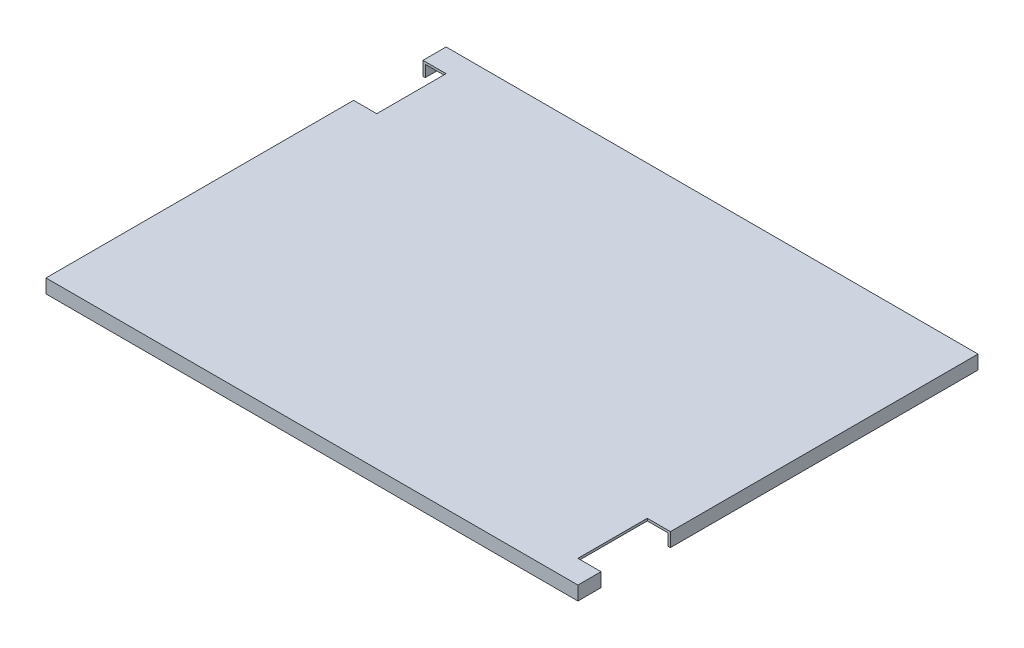
ISO-10303-21;
HEADER;
FILE_DESCRIPTION(('STEP AP214'),'2;1');
FILE_NAME('part.step','',(''),(''),'','','');
FILE_SCHEMA(('AUTOMOTIVE_DESIGN { 1 0 10303 214 1 1 1 1 }'));
ENDSEC;
DATA;
#1=APPLICATION_CONTEXT('core data for automotive mechanical design processes');
#2=APPLICATION_PROTOCOL_DEFINITION('international standard','automotive_design',2000,#1);
#3=PRODUCT_CONTEXT('',#1,'mechanical');
#4=PRODUCT('Part','Part','',(#3));
#5=PRODUCT_RELATED_PRODUCT_CATEGORY('part','',(#4));
#6=PRODUCT_DEFINITION_FORMATION('','',#4);
#7=PRODUCT_DEFINITION_CONTEXT('part definition',#1,'design');
#8=PRODUCT_DEFINITION('design','',#6,#7);
#9=PRODUCT_DEFINITION_SHAPE('','',#8);
#10=(LENGTH_UNIT() NAMED_UNIT(*) SI_UNIT(.MILLI.,.METRE.));
#11=(NAMED_UNIT(*) PLANE_ANGLE_UNIT() SI_UNIT($,.RADIAN.));
#12=(NAMED_UNIT(*) SI_UNIT($,.STERADIAN.) SOLID_ANGLE_UNIT());
#13=UNCERTAINTY_MEASURE_WITH_UNIT(LENGTH_MEASURE(1.E-05),#10,'distance_accuracy_value','');
#14=(GEOMETRIC_REPRESENTATION_CONTEXT(3) GLOBAL_UNCERTAINTY_ASSIGNED_CONTEXT((#13)) GLOBAL_UNIT_ASSIGNED_CONTEXT((#10,
#11,#12)) REPRESENTATION_CONTEXT('',''));
#15=CARTESIAN_POINT('',(0.,0.,0.));
#16=DIRECTION('',(0.,0.,1.));
#17=DIRECTION('',(1.,0.,0.));
#18=AXIS2_PLACEMENT_3D('',#15,#16,#17);
#19=CARTESIAN_POINT('',(115.,6.,86.5));
#20=DIRECTION('',(-1.,0.,0.));
#21=DIRECTION('',(0.,0.,1.));
#22=AXIS2_PLACEMENT_3D('',#19,#20,#21);
#23=PLANE('',#22);
#24=DIRECTION('',(0.,1.,0.));
#25=VECTOR('',#24,1.);
#26=CARTESIAN_POINT('',(115.,0.,46.5));
#27=LINE('',#26,#25);
#28=CARTESIAN_POINT('',(115.,0.,46.5));
#29=VERTEX_POINT('',#28);
#30=CARTESIAN_POINT('',(115.,6.,46.5));
#31=VERTEX_POINT('',#30);
#32=EDGE_CURVE('E184',#29,#31,#27,.T.);
#33=ORIENTED_EDGE('',*,*,#32,.F.);
#34=DIRECTION('',(0.,0.,-1.));
#35=VECTOR('',#34,1.);
#36=CARTESIAN_POINT('',(115.,0.,86.5));
#37=LINE('',#36,#35);
#38=CARTESIAN_POINT('',(115.,0.,-86.5));
#39=VERTEX_POINT('',#38);
#40=EDGE_CURVE('E196',#29,#39,#37,.T.);
#41=ORIENTED_EDGE('',*,*,#40,.T.);
#42=DIRECTION('',(0.,-1.,0.));
#43=VECTOR('',#42,1.);
#44=CARTESIAN_POINT('',(115.,6.,-86.5));
#45=LINE('',#44,#43);
#46=CARTESIAN_POINT('',(115.,6.,-86.5));
#47=VERTEX_POINT('',#46);
#48=EDGE_CURVE('E242',#47,#39,#45,.T.);
#49=ORIENTED_EDGE('',*,*,#48,.F.);
#50=DIRECTION('',(0.,0.,-1.));
#51=VECTOR('',#50,1.);
#52=CARTESIAN_POINT('',(115.,6.,86.5));
#53=LINE('',#52,#51);
#54=EDGE_CURVE('E199',#31,#47,#53,.T.);
#55=ORIENTED_EDGE('',*,*,#54,.F.);
#56=EDGE_LOOP('',(#33,#41,#49,#55));
#57=FACE_BOUND('',#56,.T.);
#58=ADVANCED_FACE('F44',(#57),#23,.F.);
#59=CARTESIAN_POINT('',(-115.,6.,86.5));
#60=DIRECTION('',(1.,0.,0.));
#61=DIRECTION('',(0.,0.,-1.));
#62=AXIS2_PLACEMENT_3D('',#59,#60,#61);
#63=PLANE('',#62);
#64=DIRECTION('',(0.,1.,0.));
#65=VECTOR('',#64,1.);
#66=CARTESIAN_POINT('',(-115.,0.,-46.5));
#67=LINE('',#66,#65);
#68=CARTESIAN_POINT('',(-115.,0.,-46.5));
#69=VERTEX_POINT('',#68);
#70=CARTESIAN_POINT('',(-115.,6.,-46.5));
#71=VERTEX_POINT('',#70);
#72=EDGE_CURVE('E287',#69,#71,#67,.T.);
#73=ORIENTED_EDGE('',*,*,#72,.F.);
#74=DIRECTION('',(0.,0.,1.));
#75=VECTOR('',#74,1.);
#76=CARTESIAN_POINT('',(-115.,0.,86.5));
#77=LINE('',#76,#75);
#78=CARTESIAN_POINT('',(-115.,0.,86.5));
#79=VERTEX_POINT('',#78);
#80=EDGE_CURVE('E224',#69,#79,#77,.T.);
#81=ORIENTED_EDGE('',*,*,#80,.T.);
#82=DIRECTION('',(0.,-1.,0.));
#83=VECTOR('',#82,1.);
#84=CARTESIAN_POINT('',(-115.,6.,86.5));
#85=LINE('',#84,#83);
#86=CARTESIAN_POINT('',(-115.,6.,86.5));
#87=VERTEX_POINT('',#86);
#88=EDGE_CURVE('E231',#87,#79,#85,.T.);
#89=ORIENTED_EDGE('',*,*,#88,.F.);
#90=DIRECTION('',(0.,0.,1.));
#91=VECTOR('',#90,1.);
#92=CARTESIAN_POINT('',(-115.,6.,86.5));
#93=LINE('',#92,#91);
#94=EDGE_CURVE('E378',#71,#87,#93,.T.);
#95=ORIENTED_EDGE('',*,*,#94,.F.);
#96=EDGE_LOOP('',(#73,#81,#89,#95));
#97=FACE_BOUND('',#96,.T.);
#98=ADVANCED_FACE('F398',(#97),#63,.F.);
#99=CARTESIAN_POINT('',(0.,0.,0.));
#100=DIRECTION('',(0.,-1.,0.));
#101=DIRECTION('',(0.,0.,-1.));
#102=AXIS2_PLACEMENT_3D('',#99,#100,#101);
#103=PLANE('',#102);
#104=DIRECTION('',(0.,0.,-1.));
#105=VECTOR('',#104,1.);
#106=CARTESIAN_POINT('',(114.,0.,85.5));
#107=LINE('',#106,#105);
#108=CARTESIAN_POINT('',(114.,0.,85.5));
#109=VERTEX_POINT('',#108);
#110=CARTESIAN_POINT('',(114.,0.,76.5));
#111=VERTEX_POINT('',#110);
#112=EDGE_CURVE('E354',#109,#111,#107,.T.);
#113=ORIENTED_EDGE('',*,*,#112,.T.);
#114=DIRECTION('',(1.,0.,0.));
#115=VECTOR('',#114,1.);
#116=CARTESIAN_POINT('',(115.,0.,76.5));
#117=LINE('',#116,#115);
#118=CARTESIAN_POINT('',(115.,0.,76.5));
#119=VERTEX_POINT('',#118);
#120=EDGE_CURVE('E194',#111,#119,#117,.T.);
#121=ORIENTED_EDGE('',*,*,#120,.T.);
#122=CARTESIAN_POINT('',(115.,0.,86.5));
#123=VERTEX_POINT('',#122);
#124=EDGE_CURVE('E208',#123,#119,#37,.T.);
#125=ORIENTED_EDGE('',*,*,#124,.F.);
#126=DIRECTION('',(1.,0.,0.));
#127=VECTOR('',#126,1.);
#128=CARTESIAN_POINT('',(-115.,0.,86.5));
#129=LINE('',#128,#127);
#130=EDGE_CURVE('E227',#79,#123,#129,.T.);
#131=ORIENTED_EDGE('',*,*,#130,.F.);
#132=ORIENTED_EDGE('',*,*,#80,.F.);
#133=DIRECTION('',(1.,0.,0.));
#134=VECTOR('',#133,1.);
#135=CARTESIAN_POINT('',(-115.,0.,-46.5));
#136=LINE('',#135,#134);
#137=CARTESIAN_POINT('',(-114.,0.,-46.5));
#138=VERTEX_POINT('',#137);
#139=EDGE_CURVE('E301',#69,#138,#136,.T.);
#140=ORIENTED_EDGE('',*,*,#139,.T.);
#141=DIRECTION('',(0.,0.,1.));
#142=VECTOR('',#141,1.);
#143=CARTESIAN_POINT('',(-114.,0.,85.5));
#144=LINE('',#143,#142);
#145=CARTESIAN_POINT('',(-114.,0.,85.5));
#146=VERTEX_POINT('',#145);
#147=EDGE_CURVE('E328',#138,#146,#144,.T.);
#148=ORIENTED_EDGE('',*,*,#147,.T.);
#149=DIRECTION('',(1.,0.,0.));
#150=VECTOR('',#149,1.);
#151=CARTESIAN_POINT('',(114.,0.,85.5));
#152=LINE('',#151,#150);
#153=EDGE_CURVE('E348',#146,#109,#152,.T.);
#154=ORIENTED_EDGE('',*,*,#153,.T.);
#155=EDGE_LOOP('',(#113,#121,#125,#131,#132,#140,#148,#154));
#156=FACE_BOUND('',#155,.T.);
#157=ADVANCED_FACE('F412',(#156),#103,.T.);
#158=ORIENTED_EDGE('',*,*,#40,.F.);
#159=DIRECTION('',(-1.,0.,0.));
#160=VECTOR('',#159,1.);
#161=CARTESIAN_POINT('',(115.,0.,46.5));
#162=LINE('',#161,#160);
#163=CARTESIAN_POINT('',(114.,0.,46.5));
#164=VERTEX_POINT('',#163);
#165=EDGE_CURVE('E182',#29,#164,#162,.T.);
#166=ORIENTED_EDGE('',*,*,#165,.T.);
#167=CARTESIAN_POINT('',(114.,0.,-85.5));
#168=VERTEX_POINT('',#167);
#169=EDGE_CURVE('E353',#164,#168,#107,.T.);
#170=ORIENTED_EDGE('',*,*,#169,.T.);
#171=DIRECTION('',(-1.,0.,0.));
#172=VECTOR('',#171,1.);
#173=CARTESIAN_POINT('',(114.,0.,-85.5));
#174=LINE('',#173,#172);
#175=CARTESIAN_POINT('',(-114.,0.,-85.5));
#176=VERTEX_POINT('',#175);
#177=EDGE_CURVE('E360',#168,#176,#174,.T.);
#178=ORIENTED_EDGE('',*,*,#177,.T.);
#179=CARTESIAN_POINT('',(-114.,0.,-76.5));
#180=VERTEX_POINT('',#179);
#181=EDGE_CURVE('E347',#176,#180,#144,.T.);
#182=ORIENTED_EDGE('',*,*,#181,.T.);
#183=DIRECTION('',(-1.,0.,0.));
#184=VECTOR('',#183,1.);
#185=CARTESIAN_POINT('',(-115.,0.,-76.5));
#186=LINE('',#185,#184);
#187=CARTESIAN_POINT('',(-115.,0.,-76.5));
#188=VERTEX_POINT('',#187);
#189=EDGE_CURVE('E292',#180,#188,#186,.T.);
#190=ORIENTED_EDGE('',*,*,#189,.T.);
#191=CARTESIAN_POINT('',(-115.,0.,-86.5));
#192=VERTEX_POINT('',#191);
#193=EDGE_CURVE('E221',#192,#188,#77,.T.);
#194=ORIENTED_EDGE('',*,*,#193,.F.);
#195=DIRECTION('',(-1.,0.,0.));
#196=VECTOR('',#195,1.);
#197=CARTESIAN_POINT('',(-115.,0.,-86.5));
#198=LINE('',#197,#196);
#199=EDGE_CURVE('E202',#39,#192,#198,.T.);
#200=ORIENTED_EDGE('',*,*,#199,.F.);
#201=EDGE_LOOP('',(#158,#166,#170,#178,#182,#190,#194,#200));
#202=FACE_BOUND('',#201,.T.);
#203=ADVANCED_FACE('F201',(#202),#103,.T.);
#204=CARTESIAN_POINT('',(0.,6.,0.));
#205=DIRECTION('',(0.,-1.,0.));
#206=DIRECTION('',(0.,0.,-1.));
#207=AXIS2_PLACEMENT_3D('',#204,#205,#206);
#208=PLANE('',#207);
#209=DIRECTION('',(-1.,0.,0.));
#210=VECTOR('',#209,1.);
#211=CARTESIAN_POINT('',(115.,6.,46.5));
#212=LINE('',#211,#210);
#213=CARTESIAN_POINT('',(105.,6.,46.5));
#214=VERTEX_POINT('',#213);
#215=EDGE_CURVE('E315',#31,#214,#212,.T.);
#216=ORIENTED_EDGE('',*,*,#215,.F.);
#217=ORIENTED_EDGE('',*,*,#54,.T.);
#218=DIRECTION('',(-1.,0.,0.));
#219=VECTOR('',#218,1.);
#220=CARTESIAN_POINT('',(-115.,6.,-86.5));
#221=LINE('',#220,#219);
#222=CARTESIAN_POINT('',(-115.,6.,-86.5));
#223=VERTEX_POINT('',#222);
#224=EDGE_CURVE('E376',#47,#223,#221,.T.);
#225=ORIENTED_EDGE('',*,*,#224,.T.);
#226=CARTESIAN_POINT('',(-115.,6.,-76.5));
#227=VERTEX_POINT('',#226);
#228=EDGE_CURVE('E377',#223,#227,#93,.T.);
#229=ORIENTED_EDGE('',*,*,#228,.T.);
#230=DIRECTION('',(-1.,0.,0.));
#231=VECTOR('',#230,1.);
#232=CARTESIAN_POINT('',(-115.,6.,-76.5));
#233=LINE('',#232,#231);
#234=CARTESIAN_POINT('',(-105.,6.,-76.5));
#235=VERTEX_POINT('',#234);
#236=EDGE_CURVE('E303',#235,#227,#233,.T.);
#237=ORIENTED_EDGE('',*,*,#236,.F.);
#238=DIRECTION('',(0.,0.,-1.));
#239=VECTOR('',#238,1.);
#240=CARTESIAN_POINT('',(-105.,6.,-76.5));
#241=LINE('',#240,#239);
#242=CARTESIAN_POINT('',(-105.,6.,-46.5));
#243=VERTEX_POINT('',#242);
#244=EDGE_CURVE('E305',#243,#235,#241,.T.);
#245=ORIENTED_EDGE('',*,*,#244,.F.);
#246=DIRECTION('',(1.,0.,0.));
#247=VECTOR('',#246,1.);
#248=CARTESIAN_POINT('',(-115.,6.,-46.5));
#249=LINE('',#248,#247);
#250=EDGE_CURVE('E310',#71,#243,#249,.T.);
#251=ORIENTED_EDGE('',*,*,#250,.F.);
#252=ORIENTED_EDGE('',*,*,#94,.T.);
#253=DIRECTION('',(1.,0.,0.));
#254=VECTOR('',#253,1.);
#255=CARTESIAN_POINT('',(-115.,6.,86.5));
#256=LINE('',#255,#254);
#257=CARTESIAN_POINT('',(115.,6.,86.5));
#258=VERTEX_POINT('',#257);
#259=EDGE_CURVE('E218',#87,#258,#256,.T.);
#260=ORIENTED_EDGE('',*,*,#259,.T.);
#261=CARTESIAN_POINT('',(115.,6.,76.5));
#262=VERTEX_POINT('',#261);
#263=EDGE_CURVE('E375',#258,#262,#53,.T.);
#264=ORIENTED_EDGE('',*,*,#263,.T.);
#265=DIRECTION('',(1.,0.,0.));
#266=VECTOR('',#265,1.);
#267=CARTESIAN_POINT('',(115.,6.,76.5));
#268=LINE('',#267,#266);
#269=CARTESIAN_POINT('',(105.,6.,76.5));
#270=VERTEX_POINT('',#269);
#271=EDGE_CURVE('E192',#270,#262,#268,.T.);
#272=ORIENTED_EDGE('',*,*,#271,.F.);
#273=DIRECTION('',(0.,0.,1.));
#274=VECTOR('',#273,1.);
#275=CARTESIAN_POINT('',(105.,6.,76.5));
#276=LINE('',#275,#274);
#277=EDGE_CURVE('E273',#214,#270,#276,.T.);
#278=ORIENTED_EDGE('',*,*,#277,.F.);
#279=EDGE_LOOP('',(#216,#217,#225,#229,#237,#245,#251,#252,#260,#264,#272,#278));
#280=FACE_BOUND('',#279,.T.);
#281=ADVANCED_FACE('F388',(#280),#208,.F.);
#282=CARTESIAN_POINT('',(-114.,5.,85.5));
#283=DIRECTION('',(1.,0.,0.));
#284=DIRECTION('',(0.,0.,-1.));
#285=AXIS2_PLACEMENT_3D('',#282,#283,#284);
#286=PLANE('',#285);
#287=DIRECTION('',(0.,1.,0.));
#288=VECTOR('',#287,1.);
#289=CARTESIAN_POINT('',(-114.,5.,-76.5));
#290=LINE('',#289,#288);
#291=CARTESIAN_POINT('',(-114.,5.,-76.5));
#292=VERTEX_POINT('',#291);
#293=EDGE_CURVE('E321',#180,#292,#290,.T.);
#294=ORIENTED_EDGE('',*,*,#293,.F.);
#295=ORIENTED_EDGE('',*,*,#181,.F.);
#296=DIRECTION('',(0.,-1.,0.));
#297=VECTOR('',#296,1.);
#298=CARTESIAN_POINT('',(-114.,5.,-85.5));
#299=LINE('',#298,#297);
#300=CARTESIAN_POINT('',(-114.,5.,-85.5));
#301=VERTEX_POINT('',#300);
#302=EDGE_CURVE('E341',#301,#176,#299,.T.);
#303=ORIENTED_EDGE('',*,*,#302,.F.);
#304=DIRECTION('',(0.,0.,1.));
#305=VECTOR('',#304,1.);
#306=CARTESIAN_POINT('',(-114.,5.,85.5));
#307=LINE('',#306,#305);
#308=EDGE_CURVE('E329',#301,#292,#307,.T.);
#309=ORIENTED_EDGE('',*,*,#308,.T.);
#310=EDGE_LOOP('',(#294,#295,#303,#309));
#311=FACE_BOUND('',#310,.T.);
#312=ADVANCED_FACE('F445',(#311),#286,.T.);
#313=CARTESIAN_POINT('',(114.,5.,85.5));
#314=DIRECTION('',(-1.,0.,0.));
#315=DIRECTION('',(0.,0.,1.));
#316=AXIS2_PLACEMENT_3D('',#313,#314,#315);
#317=PLANE('',#316);
#318=DIRECTION('',(0.,1.,0.));
#319=VECTOR('',#318,1.);
#320=CARTESIAN_POINT('',(114.,5.,76.5));
#321=LINE('',#320,#319);
#322=CARTESIAN_POINT('',(114.,5.,76.5));
#323=VERTEX_POINT('',#322);
#324=EDGE_CURVE('E326',#111,#323,#321,.T.);
#325=ORIENTED_EDGE('',*,*,#324,.F.);
#326=ORIENTED_EDGE('',*,*,#112,.F.);
#327=DIRECTION('',(0.,-1.,0.));
#328=VECTOR('',#327,1.);
#329=CARTESIAN_POINT('',(114.,5.,85.5));
#330=LINE('',#329,#328);
#331=CARTESIAN_POINT('',(114.,5.,85.5));
#332=VERTEX_POINT('',#331);
#333=EDGE_CURVE('E214',#332,#109,#330,.T.);
#334=ORIENTED_EDGE('',*,*,#333,.F.);
#335=DIRECTION('',(0.,0.,-1.));
#336=VECTOR('',#335,1.);
#337=CARTESIAN_POINT('',(114.,5.,85.5));
#338=LINE('',#337,#336);
#339=EDGE_CURVE('E338',#332,#323,#338,.T.);
#340=ORIENTED_EDGE('',*,*,#339,.T.);
#341=EDGE_LOOP('',(#325,#326,#334,#340));
#342=FACE_BOUND('',#341,.T.);
#343=ADVANCED_FACE('F416',(#342),#317,.T.);
#344=ORIENTED_EDGE('',*,*,#124,.T.);
#345=DIRECTION('',(0.,1.,0.));
#346=VECTOR('',#345,1.);
#347=CARTESIAN_POINT('',(115.,0.,76.5));
#348=LINE('',#347,#346);
#349=EDGE_CURVE('E279',#119,#262,#348,.T.);
#350=ORIENTED_EDGE('',*,*,#349,.T.);
#351=ORIENTED_EDGE('',*,*,#263,.F.);
#352=DIRECTION('',(0.,-1.,0.));
#353=VECTOR('',#352,1.);
#354=CARTESIAN_POINT('',(115.,6.,86.5));
#355=LINE('',#354,#353);
#356=EDGE_CURVE('E233',#258,#123,#355,.T.);
#357=ORIENTED_EDGE('',*,*,#356,.T.);
#358=EDGE_LOOP('',(#344,#350,#351,#357));
#359=FACE_BOUND('',#358,.T.);
#360=ADVANCED_FACE('F50',(#359),#23,.F.);
#361=CARTESIAN_POINT('',(-115.,6.,-86.5));
#362=DIRECTION('',(0.,0.,1.));
#363=DIRECTION('',(1.,0.,0.));
#364=AXIS2_PLACEMENT_3D('',#361,#362,#363);
#365=PLANE('',#364);
#366=ORIENTED_EDGE('',*,*,#199,.T.);
#367=DIRECTION('',(0.,-1.,0.));
#368=VECTOR('',#367,1.);
#369=CARTESIAN_POINT('',(-115.,6.,-86.5));
#370=LINE('',#369,#368);
#371=EDGE_CURVE('E239',#223,#192,#370,.T.);
#372=ORIENTED_EDGE('',*,*,#371,.F.);
#373=ORIENTED_EDGE('',*,*,#224,.F.);
#374=ORIENTED_EDGE('',*,*,#48,.T.);
#375=EDGE_LOOP('',(#366,#372,#373,#374));
#376=FACE_BOUND('',#375,.T.);
#377=ADVANCED_FACE('F466',(#376),#365,.F.);
#378=ORIENTED_EDGE('',*,*,#193,.T.);
#379=DIRECTION('',(0.,1.,0.));
#380=VECTOR('',#379,1.);
#381=CARTESIAN_POINT('',(-115.,0.,-76.5));
#382=LINE('',#381,#380);
#383=EDGE_CURVE('E300',#188,#227,#382,.T.);
#384=ORIENTED_EDGE('',*,*,#383,.T.);
#385=ORIENTED_EDGE('',*,*,#228,.F.);
#386=ORIENTED_EDGE('',*,*,#371,.T.);
#387=EDGE_LOOP('',(#378,#384,#385,#386));
#388=FACE_BOUND('',#387,.T.);
#389=ADVANCED_FACE('F467',(#388),#63,.F.);
#390=CARTESIAN_POINT('',(-115.,6.,86.5));
#391=DIRECTION('',(0.,0.,-1.));
#392=DIRECTION('',(-1.,0.,0.));
#393=AXIS2_PLACEMENT_3D('',#390,#391,#392);
#394=PLANE('',#393);
#395=ORIENTED_EDGE('',*,*,#130,.T.);
#396=ORIENTED_EDGE('',*,*,#356,.F.);
#397=ORIENTED_EDGE('',*,*,#259,.F.);
#398=ORIENTED_EDGE('',*,*,#88,.T.);
#399=EDGE_LOOP('',(#395,#396,#397,#398));
#400=FACE_BOUND('',#399,.T.);
#401=ADVANCED_FACE('F396',(#400),#394,.F.);
#402=DIRECTION('',(0.,-1.,0.));
#403=VECTOR('',#402,1.);
#404=CARTESIAN_POINT('',(-114.,5.,-46.5));
#405=LINE('',#404,#403);
#406=CARTESIAN_POINT('',(-114.,5.,-46.5));
#407=VERTEX_POINT('',#406);
#408=EDGE_CURVE('E282',#407,#138,#405,.T.);
#409=ORIENTED_EDGE('',*,*,#408,.F.);
#410=CARTESIAN_POINT('',(-114.,5.,85.5));
#411=VERTEX_POINT('',#410);
#412=EDGE_CURVE('E333',#407,#411,#307,.T.);
#413=ORIENTED_EDGE('',*,*,#412,.T.);
#414=DIRECTION('',(0.,-1.,0.));
#415=VECTOR('',#414,1.);
#416=CARTESIAN_POINT('',(-114.,5.,85.5));
#417=LINE('',#416,#415);
#418=EDGE_CURVE('E207',#411,#146,#417,.T.);
#419=ORIENTED_EDGE('',*,*,#418,.T.);
#420=ORIENTED_EDGE('',*,*,#147,.F.);
#421=EDGE_LOOP('',(#409,#413,#419,#420));
#422=FACE_BOUND('',#421,.T.);
#423=ADVANCED_FACE('F427',(#422),#286,.T.);
#424=CARTESIAN_POINT('',(114.,5.,85.5));
#425=DIRECTION('',(0.,0.,-1.));
#426=DIRECTION('',(-1.,0.,0.));
#427=AXIS2_PLACEMENT_3D('',#424,#425,#426);
#428=PLANE('',#427);
#429=ORIENTED_EDGE('',*,*,#153,.F.);
#430=ORIENTED_EDGE('',*,*,#418,.F.);
#431=DIRECTION('',(1.,0.,0.));
#432=VECTOR('',#431,1.);
#433=CARTESIAN_POINT('',(114.,5.,85.5));
#434=LINE('',#433,#432);
#435=EDGE_CURVE('E331',#411,#332,#434,.T.);
#436=ORIENTED_EDGE('',*,*,#435,.T.);
#437=ORIENTED_EDGE('',*,*,#333,.T.);
#438=EDGE_LOOP('',(#429,#430,#436,#437));
#439=FACE_BOUND('',#438,.T.);
#440=ADVANCED_FACE('F422',(#439),#428,.T.);
#441=DIRECTION('',(0.,-1.,0.));
#442=VECTOR('',#441,1.);
#443=CARTESIAN_POINT('',(114.,5.,46.5));
#444=LINE('',#443,#442);
#445=CARTESIAN_POINT('',(114.,5.,46.5));
#446=VERTEX_POINT('',#445);
#447=EDGE_CURVE('E190',#446,#164,#444,.T.);
#448=ORIENTED_EDGE('',*,*,#447,.F.);
#449=CARTESIAN_POINT('',(114.,5.,-85.5));
#450=VERTEX_POINT('',#449);
#451=EDGE_CURVE('E337',#446,#450,#338,.T.);
#452=ORIENTED_EDGE('',*,*,#451,.T.);
#453=DIRECTION('',(0.,-1.,0.));
#454=VECTOR('',#453,1.);
#455=CARTESIAN_POINT('',(114.,5.,-85.5));
#456=LINE('',#455,#454);
#457=EDGE_CURVE('E368',#450,#168,#456,.T.);
#458=ORIENTED_EDGE('',*,*,#457,.T.);
#459=ORIENTED_EDGE('',*,*,#169,.F.);
#460=EDGE_LOOP('',(#448,#452,#458,#459));
#461=FACE_BOUND('',#460,.T.);
#462=ADVANCED_FACE('F453',(#461),#317,.T.);
#463=CARTESIAN_POINT('',(114.,5.,-85.5));
#464=DIRECTION('',(0.,0.,1.));
#465=DIRECTION('',(1.,0.,0.));
#466=AXIS2_PLACEMENT_3D('',#463,#464,#465);
#467=PLANE('',#466);
#468=ORIENTED_EDGE('',*,*,#177,.F.);
#469=ORIENTED_EDGE('',*,*,#457,.F.);
#470=DIRECTION('',(-1.,0.,0.));
#471=VECTOR('',#470,1.);
#472=CARTESIAN_POINT('',(114.,5.,-85.5));
#473=LINE('',#472,#471);
#474=EDGE_CURVE('E344',#450,#301,#473,.T.);
#475=ORIENTED_EDGE('',*,*,#474,.T.);
#476=ORIENTED_EDGE('',*,*,#302,.T.);
#477=EDGE_LOOP('',(#468,#469,#475,#476));
#478=FACE_BOUND('',#477,.T.);
#479=ADVANCED_FACE('F450',(#478),#467,.T.);
#480=CARTESIAN_POINT('',(0.,5.,0.));
#481=DIRECTION('',(0.,1.,0.));
#482=DIRECTION('',(0.,0.,1.));
#483=AXIS2_PLACEMENT_3D('',#480,#481,#482);
#484=PLANE('',#483);
#485=DIRECTION('',(0.,0.,1.));
#486=VECTOR('',#485,1.);
#487=CARTESIAN_POINT('',(105.,5.,0.));
#488=LINE('',#487,#486);
#489=CARTESIAN_POINT('',(105.,5.,46.5));
#490=VERTEX_POINT('',#489);
#491=CARTESIAN_POINT('',(105.,5.,76.5));
#492=VERTEX_POINT('',#491);
#493=EDGE_CURVE('E53',#490,#492,#488,.T.);
#494=ORIENTED_EDGE('',*,*,#493,.T.);
#495=DIRECTION('',(1.,0.,0.));
#496=VECTOR('',#495,1.);
#497=CARTESIAN_POINT('',(0.,5.,76.5));
#498=LINE('',#497,#496);
#499=EDGE_CURVE('E11',#492,#323,#498,.T.);
#500=ORIENTED_EDGE('',*,*,#499,.T.);
#501=ORIENTED_EDGE('',*,*,#339,.F.);
#502=ORIENTED_EDGE('',*,*,#435,.F.);
#503=ORIENTED_EDGE('',*,*,#412,.F.);
#504=DIRECTION('',(1.,0.,0.));
#505=VECTOR('',#504,1.);
#506=CARTESIAN_POINT('',(0.,5.,-46.5000000000001));
#507=LINE('',#506,#505);
#508=CARTESIAN_POINT('',(-105.,5.,-46.5));
#509=VERTEX_POINT('',#508);
#510=EDGE_CURVE('E248',#407,#509,#507,.T.);
#511=ORIENTED_EDGE('',*,*,#510,.T.);
#512=DIRECTION('',(0.,0.,-1.));
#513=VECTOR('',#512,1.);
#514=CARTESIAN_POINT('',(-105.,5.,0.));
#515=LINE('',#514,#513);
#516=CARTESIAN_POINT('',(-105.,5.,-76.5));
#517=VERTEX_POINT('',#516);
#518=EDGE_CURVE('E246',#509,#517,#515,.T.);
#519=ORIENTED_EDGE('',*,*,#518,.T.);
#520=DIRECTION('',(-1.,0.,0.));
#521=VECTOR('',#520,1.);
#522=CARTESIAN_POINT('',(0.,5.,-76.5));
#523=LINE('',#522,#521);
#524=EDGE_CURVE('E255',#517,#292,#523,.T.);
#525=ORIENTED_EDGE('',*,*,#524,.T.);
#526=ORIENTED_EDGE('',*,*,#308,.F.);
#527=ORIENTED_EDGE('',*,*,#474,.F.);
#528=ORIENTED_EDGE('',*,*,#451,.F.);
#529=DIRECTION('',(-1.,0.,0.));
#530=VECTOR('',#529,1.);
#531=CARTESIAN_POINT('',(0.,5.,46.5));
#532=LINE('',#531,#530);
#533=EDGE_CURVE('E256',#446,#490,#532,.T.);
#534=ORIENTED_EDGE('',*,*,#533,.T.);
#535=EDGE_LOOP('',(#494,#500,#501,#502,#503,#511,#519,#525,#526,#527,#528,#534));
#536=FACE_BOUND('',#535,.T.);
#537=ADVANCED_FACE('F262',(#536),#484,.F.);
#538=CARTESIAN_POINT('',(-105.,0.,-76.5));
#539=DIRECTION('',(1.,0.,0.));
#540=DIRECTION('',(0.,0.,-1.));
#541=AXIS2_PLACEMENT_3D('',#538,#539,#540);
#542=PLANE('',#541);
#543=DIRECTION('',(0.,1.,0.));
#544=VECTOR('',#543,1.);
#545=CARTESIAN_POINT('',(-105.,0.,-46.5));
#546=LINE('',#545,#544);
#547=EDGE_CURVE('E70',#509,#243,#546,.T.);
#548=ORIENTED_EDGE('',*,*,#547,.T.);
#549=ORIENTED_EDGE('',*,*,#244,.T.);
#550=DIRECTION('',(0.,1.,0.));
#551=VECTOR('',#550,1.);
#552=CARTESIAN_POINT('',(-105.,0.,-76.5));
#553=LINE('',#552,#551);
#554=EDGE_CURVE('E294',#517,#235,#553,.T.);
#555=ORIENTED_EDGE('',*,*,#554,.F.);
#556=ORIENTED_EDGE('',*,*,#518,.F.);
#557=EDGE_LOOP('',(#548,#549,#555,#556));
#558=FACE_BOUND('',#557,.T.);
#559=ADVANCED_FACE('F440',(#558),#542,.F.);
#560=CARTESIAN_POINT('',(-115.,0.,-76.5));
#561=DIRECTION('',(0.,0.,-1.));
#562=DIRECTION('',(-1.,0.,0.));
#563=AXIS2_PLACEMENT_3D('',#560,#561,#562);
#564=PLANE('',#563);
#565=ORIENTED_EDGE('',*,*,#293,.T.);
#566=ORIENTED_EDGE('',*,*,#524,.F.);
#567=ORIENTED_EDGE('',*,*,#554,.T.);
#568=ORIENTED_EDGE('',*,*,#236,.T.);
#569=ORIENTED_EDGE('',*,*,#383,.F.);
#570=ORIENTED_EDGE('',*,*,#189,.F.);
#571=EDGE_LOOP('',(#565,#566,#567,#568,#569,#570));
#572=FACE_BOUND('',#571,.T.);
#573=ADVANCED_FACE('F438',(#572),#564,.F.);
#574=CARTESIAN_POINT('',(-115.,0.,-46.5));
#575=DIRECTION('',(0.,0.,1.));
#576=DIRECTION('',(1.,0.,0.));
#577=AXIS2_PLACEMENT_3D('',#574,#575,#576);
#578=PLANE('',#577);
#579=ORIENTED_EDGE('',*,*,#408,.T.);
#580=ORIENTED_EDGE('',*,*,#139,.F.);
#581=ORIENTED_EDGE('',*,*,#72,.T.);
#582=ORIENTED_EDGE('',*,*,#250,.T.);
#583=ORIENTED_EDGE('',*,*,#547,.F.);
#584=ORIENTED_EDGE('',*,*,#510,.F.);
#585=EDGE_LOOP('',(#579,#580,#581,#582,#583,#584));
#586=FACE_BOUND('',#585,.T.);
#587=ADVANCED_FACE('F433',(#586),#578,.F.);
#588=CARTESIAN_POINT('',(105.,0.,76.5));
#589=DIRECTION('',(-1.,0.,0.));
#590=DIRECTION('',(0.,0.,1.));
#591=AXIS2_PLACEMENT_3D('',#588,#589,#590);
#592=PLANE('',#591);
#593=DIRECTION('',(0.,1.,0.));
#594=VECTOR('',#593,1.);
#595=CARTESIAN_POINT('',(105.,0.,46.5));
#596=LINE('',#595,#594);
#597=EDGE_CURVE('E61',#490,#214,#596,.T.);
#598=ORIENTED_EDGE('',*,*,#597,.T.);
#599=ORIENTED_EDGE('',*,*,#277,.T.);
#600=DIRECTION('',(0.,1.,0.));
#601=VECTOR('',#600,1.);
#602=CARTESIAN_POINT('',(105.,0.,76.5));
#603=LINE('',#602,#601);
#604=EDGE_CURVE('E275',#492,#270,#603,.T.);
#605=ORIENTED_EDGE('',*,*,#604,.F.);
#606=ORIENTED_EDGE('',*,*,#493,.F.);
#607=EDGE_LOOP('',(#598,#599,#605,#606));
#608=FACE_BOUND('',#607,.T.);
#609=ADVANCED_FACE('F269',(#608),#592,.F.);
#610=CARTESIAN_POINT('',(115.,0.,76.5));
#611=DIRECTION('',(0.,0.,1.));
#612=DIRECTION('',(1.,0.,0.));
#613=AXIS2_PLACEMENT_3D('',#610,#611,#612);
#614=PLANE('',#613);
#615=ORIENTED_EDGE('',*,*,#324,.T.);
#616=ORIENTED_EDGE('',*,*,#499,.F.);
#617=ORIENTED_EDGE('',*,*,#604,.T.);
#618=ORIENTED_EDGE('',*,*,#271,.T.);
#619=ORIENTED_EDGE('',*,*,#349,.F.);
#620=ORIENTED_EDGE('',*,*,#120,.F.);
#621=EDGE_LOOP('',(#615,#616,#617,#618,#619,#620));
#622=FACE_BOUND('',#621,.T.);
#623=ADVANCED_FACE('F418',(#622),#614,.F.);
#624=CARTESIAN_POINT('',(115.,0.,46.5));
#625=DIRECTION('',(0.,0.,-1.));
#626=DIRECTION('',(-1.,0.,0.));
#627=AXIS2_PLACEMENT_3D('',#624,#625,#626);
#628=PLANE('',#627);
#629=ORIENTED_EDGE('',*,*,#447,.T.);
#630=ORIENTED_EDGE('',*,*,#165,.F.);
#631=ORIENTED_EDGE('',*,*,#32,.T.);
#632=ORIENTED_EDGE('',*,*,#215,.T.);
#633=ORIENTED_EDGE('',*,*,#597,.F.);
#634=ORIENTED_EDGE('',*,*,#533,.F.);
#635=EDGE_LOOP('',(#629,#630,#631,#632,#633,#634));
#636=FACE_BOUND('',#635,.T.);
#637=ADVANCED_FACE('F181',(#636),#628,.F.);
#638=CLOSED_SHELL('',(#58,#98,#157,#203,#281,#312,#343,#360,#377,#389,#401,#423,#440,#462,#479,
#537,#559,#573,#587,#609,#623,#637));
#639=MANIFOLD_SOLID_BREP('B2',#638);
#640=ADVANCED_BREP_SHAPE_REPRESENTATION('',(#18,#639),#14);
#641=SHAPE_DEFINITION_REPRESENTATION(#9,#640);
ENDSEC;
END-ISO-10303-21;
